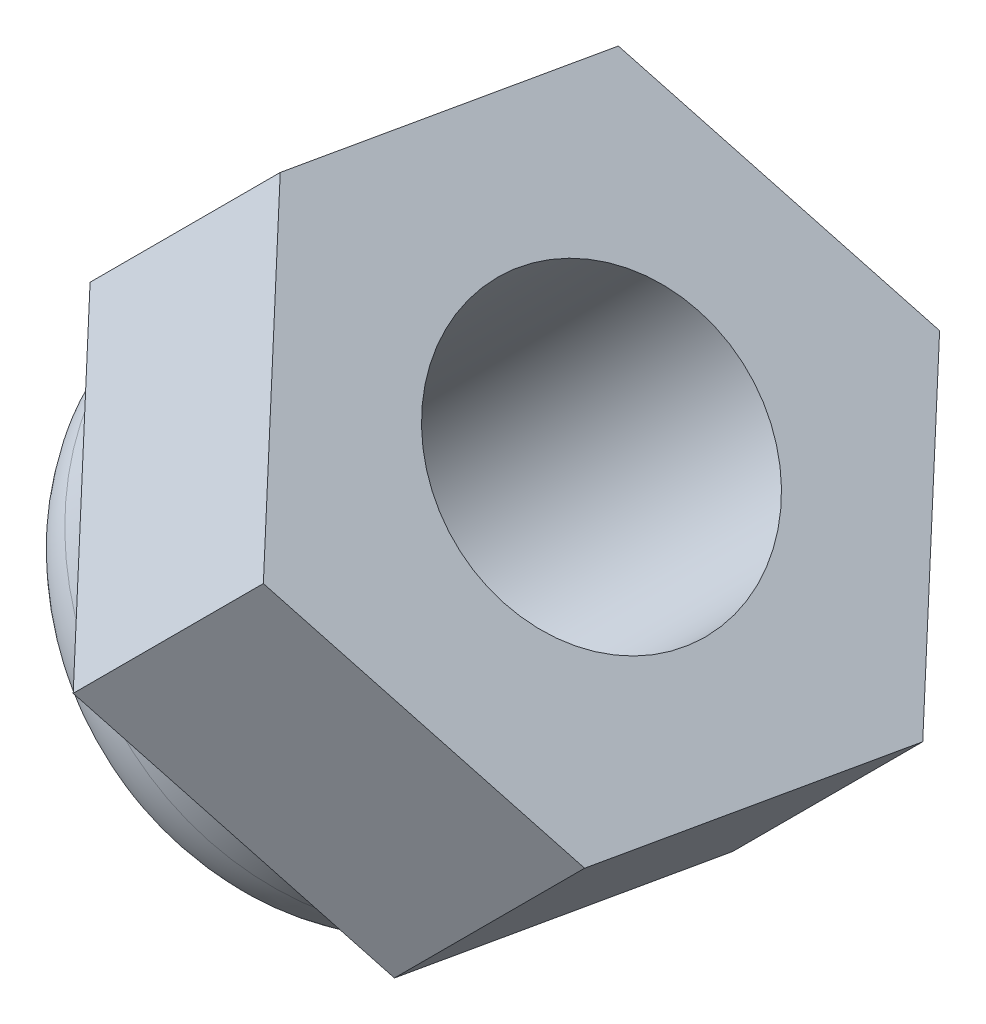
ISO-10303-21;
HEADER;
FILE_DESCRIPTION(('STEP AP214'),'2;1');
FILE_NAME('part.step','',(''),(''),'','','');
FILE_SCHEMA(('AUTOMOTIVE_DESIGN { 1 0 10303 214 1 1 1 1 }'));
ENDSEC;
DATA;
#1=APPLICATION_CONTEXT('core data for automotive mechanical design processes');
#2=APPLICATION_PROTOCOL_DEFINITION('international standard','automotive_design',2000,#1);
#3=PRODUCT_CONTEXT('',#1,'mechanical');
#4=PRODUCT('Part','Part','',(#3));
#5=PRODUCT_RELATED_PRODUCT_CATEGORY('part','',(#4));
#6=PRODUCT_DEFINITION_FORMATION('','',#4);
#7=PRODUCT_DEFINITION_CONTEXT('part definition',#1,'design');
#8=PRODUCT_DEFINITION('design','',#6,#7);
#9=PRODUCT_DEFINITION_SHAPE('','',#8);
#10=(LENGTH_UNIT() NAMED_UNIT(*) SI_UNIT(.MILLI.,.METRE.));
#11=(NAMED_UNIT(*) PLANE_ANGLE_UNIT() SI_UNIT($,.RADIAN.));
#12=(NAMED_UNIT(*) SI_UNIT($,.STERADIAN.) SOLID_ANGLE_UNIT());
#13=UNCERTAINTY_MEASURE_WITH_UNIT(LENGTH_MEASURE(1.E-05),#10,'distance_accuracy_value','');
#14=(GEOMETRIC_REPRESENTATION_CONTEXT(3) GLOBAL_UNCERTAINTY_ASSIGNED_CONTEXT((#13)) GLOBAL_UNIT_ASSIGNED_CONTEXT((#10,
#11,#12)) REPRESENTATION_CONTEXT('',''));
#15=CARTESIAN_POINT('',(0.,0.,0.));
#16=DIRECTION('',(0.,0.,1.));
#17=DIRECTION('',(1.,0.,0.));
#18=AXIS2_PLACEMENT_3D('',#15,#16,#17);
#19=CARTESIAN_POINT('',(-21.8435975632122,-44.7743989689823,53.4673160693475));
#20=DIRECTION('',(0.707105990185904,0.707106781185917,0.00105765972999167));
#21=DIRECTION('',(-0.707107176686664,0.707106385686209,0.));
#22=AXIS2_PLACEMENT_3D('',#19,#20,#21);
#23=CYLINDRICAL_SURFACE('',#22,1.49999999999726);
#24=CARTESIAN_POINT('',(-18.8383971049191,-41.769195148939,53.4718111232));
#25=DIRECTION('',(0.707105990185904,0.707106781185917,0.00105765972999167));
#26=DIRECTION('',(-0.707107176686664,0.707106385686209,0.));
#27=AXIS2_PLACEMENT_3D('',#24,#25,#26);
#28=CIRCLE('',#27,1.49999999999726);
#29=CARTESIAN_POINT('',(-19.8990578699471,-40.7085355704117,53.4718111232));
#30=VERTEX_POINT('',#29);
#31=EDGE_CURVE('E105',#30,#30,#28,.T.);
#32=ORIENTED_EDGE('',*,*,#31,.T.);
#33=EDGE_LOOP('',(#32));
#34=FACE_BOUND('',#33,.T.);
#35=CARTESIAN_POINT('',(-21.8435975632122,-44.7743989689823,53.4673160693475));
#36=DIRECTION('',(0.707105990185904,0.707106781185917,0.00105765972999167));
#37=DIRECTION('',(-0.707107176686664,0.707106385686209,0.));
#38=AXIS2_PLACEMENT_3D('',#35,#36,#37);
#39=CIRCLE('',#38,1.49999999999726);
#40=CARTESIAN_POINT('',(-22.9042583282403,-43.7137393904549,53.4673160693475));
#41=VERTEX_POINT('',#40);
#42=EDGE_CURVE('E109',#41,#41,#39,.T.);
#43=ORIENTED_EDGE('',*,*,#42,.F.);
#44=EDGE_LOOP('',(#43));
#45=FACE_BOUND('',#44,.T.);
#46=ADVANCED_FACE('F17',(#34,#45),#23,.F.);
#47=CARTESIAN_POINT('',(-23.39548276266,-43.22113606169,52.54507796637));
#48=DIRECTION('',(-0.707105990185626,-0.707106781186197,-0.00105765972869598));
#49=DIRECTION('',(0.654896304312514,-0.654330019279192,-0.378104557586792));
#50=AXIS2_PLACEMENT_3D('',#47,#48,#49);
#51=PLANE('',#50);
#52=ORIENTED_EDGE('',*,*,#42,.T.);
#53=EDGE_LOOP('',(#52));
#54=FACE_BOUND('',#53,.T.);
#55=CARTESIAN_POINT('',(-21.8435975632077,-44.7743989689877,53.46731606935));
#56=DIRECTION('',(0.707105990185918,0.707106781185903,0.00105765972999243));
#57=DIRECTION('',(-0.65489630431275,0.654330019279279,0.378104557586232));
#58=AXIS2_PLACEMENT_3D('',#55,#56,#57);
#59=CIRCLE('',#58,1.6000000000029);
#60=CARTESIAN_POINT('',(-20.7957634763075,-45.8213269998343,52.8623487772091));
#61=VERTEX_POINT('',#60);
#62=CARTESIAN_POINT('',(-22.8914316501098,-43.7274709381389,54.0722833614869));
#63=VERTEX_POINT('',#62);
#64=EDGE_CURVE('E112',#61,#63,#59,.F.);
#65=ORIENTED_EDGE('',*,*,#64,.T.);
#66=CARTESIAN_POINT('',(-21.8435975632077,-44.7743989689877,53.46731606935));
#67=DIRECTION('',(0.707105990185918,0.707106781185903,0.00105765972999243));
#68=DIRECTION('',(0.654896304312806,-0.654330019279332,-0.378104557586043));
#69=AXIS2_PLACEMENT_3D('',#66,#67,#68);
#70=CIRCLE('',#69,1.60000000000289);
#71=EDGE_CURVE('E108',#63,#61,#70,.F.);
#72=ORIENTED_EDGE('',*,*,#71,.T.);
#73=EDGE_LOOP('',(#65,#72));
#74=FACE_BOUND('',#73,.T.);
#75=ADVANCED_FACE('F189',(#54,#74),#51,.T.);
#76=CARTESIAN_POINT('',(-21.78977943227,-38.81574595516,52.08778394352));
#77=DIRECTION('',(-0.707105990186317,-0.707106781185504,-0.00105765972988303));
#78=DIRECTION('',(0.65489630431228,-0.654330019279604,-0.378104557586483));
#79=AXIS2_PLACEMENT_3D('',#76,#77,#78);
#80=PLANE('',#79);
#81=ORIENTED_EDGE('',*,*,#31,.F.);
#82=EDGE_LOOP('',(#81));
#83=FACE_BOUND('',#82,.T.);
#84=DIRECTION('',(-0.558389620781067,0.559305418448393,-0.61268138563061));
#85=VECTOR('',#84,1.);
#86=CARTESIAN_POINT('',(-20.0314095775002,-40.5794348969403,55.6452166957999));
#87=LINE('',#86,#85);
#88=CARTESIAN_POINT('',(-19.1448469833551,-41.4674515151694,56.6179790438332));
#89=VERTEX_POINT('',#88);
#90=CARTESIAN_POINT('',(-20.9179721715652,-39.691418278793,54.6724543478583));
#91=VERTEX_POINT('',#90);
#92=EDGE_CURVE('E147',#89,#91,#87,.T.);
#93=ORIENTED_EDGE('',*,*,#92,.F.);
#94=DIRECTION('',(-0.654896304313992,0.654330019277631,0.378104557586932));
#95=VECTOR('',#94,1.);
#96=CARTESIAN_POINT('',(-18.1050594499902,-42.5063399502852,56.0176574315448));
#97=LINE('',#96,#95);
#98=CARTESIAN_POINT('',(-17.0652719166297,-43.5452283854007,55.417335819255));
#99=VERTEX_POINT('',#98);
#100=EDGE_CURVE('E151',#99,#89,#97,.T.);
#101=ORIENTED_EDGE('',*,*,#100,.F.);
#102=DIRECTION('',(-0.0965066835306352,0.0950246008270699,0.990785943214564));
#103=VECTOR('',#102,1.);
#104=CARTESIAN_POINT('',(-16.9120469774152,-43.6961002022853,53.844251858935));
#105=LINE('',#104,#103);
#106=CARTESIAN_POINT('',(-16.7588220382775,-43.8469720190935,52.2711678985342));
#107=VERTEX_POINT('',#106);
#108=EDGE_CURVE('E85',#107,#99,#105,.T.);
#109=ORIENTED_EDGE('',*,*,#108,.F.);
#110=DIRECTION('',(0.558389620781152,-0.55930541845145,0.612681385627742));
#111=VECTOR('',#110,1.);
#112=CARTESIAN_POINT('',(-17.6453846323402,-42.9589554009452,51.2984055505948));
#113=LINE('',#112,#111);
#114=CARTESIAN_POINT('',(-18.5319472264852,-42.0709387827129,50.3256432025663));
#115=VERTEX_POINT('',#114);
#116=EDGE_CURVE('E81',#115,#107,#113,.T.);
#117=ORIENTED_EDGE('',*,*,#116,.F.);
#118=DIRECTION('',(0.65489630431473,-0.654330019278362,-0.37810455758439));
#119=VECTOR('',#118,1.);
#120=CARTESIAN_POINT('',(-19.5717347598502,-41.0320503475954,50.9259648148499));
#121=LINE('',#120,#119);
#122=CARTESIAN_POINT('',(-20.6115222932108,-39.9931619124808,51.5262864271382));
#123=VERTEX_POINT('',#122);
#124=EDGE_CURVE('E156',#123,#115,#121,.T.);
#125=ORIENTED_EDGE('',*,*,#124,.F.);
#126=DIRECTION('',(0.0965066835336381,-0.095024600827036,-0.990785943214275));
#127=VECTOR('',#126,1.);
#128=CARTESIAN_POINT('',(-20.7647472324302,-39.8422900955953,53.0993703874548));
#129=LINE('',#128,#127);
#130=EDGE_CURVE('E137',#91,#123,#129,.T.);
#131=ORIENTED_EDGE('',*,*,#130,.F.);
#132=EDGE_LOOP('',(#93,#101,#109,#117,#125,#131));
#133=FACE_BOUND('',#132,.T.);
#134=ADVANCED_FACE('F166',(#83,#133),#80,.F.);
#135=CARTESIAN_POINT('',(-21.1364915730218,-44.0672921878018,53.46837372908));
#136=DIRECTION('',(-0.707105990185918,-0.707106781185903,-0.00105765972999243));
#137=DIRECTION('',(0.654896304312564,-0.654330019279091,-0.37810455758688));
#138=AXIS2_PLACEMENT_3D('',#135,#136,#137);
#139=TOROIDAL_SURFACE('',#138,1.60000000000256,1.);
#140=ORIENTED_EDGE('',*,*,#64,.F.);
#141=ORIENTED_EDGE('',*,*,#71,.F.);
#142=EDGE_LOOP('',(#140,#141));
#143=FACE_BOUND('',#142,.T.);
#144=CARTESIAN_POINT('',(-21.1364915730096,-44.0672921877846,53.468373729075));
#145=DIRECTION('',(-0.707105990190919,-0.707106781180901,-0.00105765973000686));
#146=DIRECTION('',(0.654896304308537,-0.654330019284319,-0.378104557584808));
#147=AXIS2_PLACEMENT_3D('',#144,#145,#146);
#148=CIRCLE('',#147,2.60000000000498);
#149=CARTESIAN_POINT('',(-19.4337611818041,-45.7685502379271,52.4853018793526));
#150=VERTEX_POINT('',#149);
#151=EDGE_CURVE('E101',#150,#150,#148,.T.);
#152=ORIENTED_EDGE('',*,*,#151,.T.);
#153=EDGE_LOOP('',(#152));
#154=FACE_BOUND('',#153,.T.);
#155=ADVANCED_FACE('F161',(#143,#154),#139,.T.);
#156=CARTESIAN_POINT('',(-20.61422296509,-39.91271550211,51.55035746291));
#157=DIRECTION('',(-0.266668238156112,0.268052655030431,-0.925762293944753));
#158=DIRECTION('',(0.654896304314744,-0.654330019278378,-0.378104557584339));
#159=AXIS2_PLACEMENT_3D('',#156,#157,#158);
#160=PLANE('',#159);
#161=ORIENTED_EDGE('',*,*,#124,.T.);
#162=DIRECTION('',(0.707105990185911,0.707106781185908,0.00105765973077403));
#163=VECTOR('',#162,1.);
#164=CARTESIAN_POINT('',(-19.5042179629892,-43.0432106068442,50.3241889204362));
#165=LINE('',#164,#163);
#166=CARTESIAN_POINT('',(-20.476488699497,-44.015482430978,50.3227346383065));
#167=VERTEX_POINT('',#166);
#168=EDGE_CURVE('E67',#167,#115,#165,.T.);
#169=ORIENTED_EDGE('',*,*,#168,.F.);
#170=DIRECTION('',(0.654896304312922,-0.65433001927875,-0.37810455758685));
#171=VECTOR('',#170,1.);
#172=CARTESIAN_POINT('',(-21.5162762328579,-42.9765939958637,50.9230562505938));
#173=LINE('',#172,#171);
#174=CARTESIAN_POINT('',(-22.556063766219,-41.937705560749,51.5233778628794));
#175=VERTEX_POINT('',#174);
#176=EDGE_CURVE('E99',#175,#167,#173,.T.);
#177=ORIENTED_EDGE('',*,*,#176,.F.);
#178=DIRECTION('',(-0.707105990184196,-0.707106781187624,-0.00105765973077146));
#179=VECTOR('',#178,1.);
#180=CARTESIAN_POINT('',(-21.5837930297139,-40.9654337366145,51.5248321450078));
#181=LINE('',#180,#179);
#182=EDGE_CURVE('E145',#123,#175,#181,.T.);
#183=ORIENTED_EDGE('',*,*,#182,.F.);
#184=EDGE_LOOP('',(#161,#169,#177,#183));
#185=FACE_BOUND('',#184,.T.);
#186=ADVANCED_FACE('F165',(#185),#160,.T.);
#187=CARTESIAN_POINT('',(-18.52851890079,-41.99652724502,50.28679087993));
#188=DIRECTION('',(0.433822717302052,-0.432640091636797,-0.79032929912864));
#189=DIRECTION('',(0.558389620781152,-0.559305418451452,0.61268138562774));
#190=AXIS2_PLACEMENT_3D('',#187,#188,#189);
#191=PLANE('',#190);
#192=ORIENTED_EDGE('',*,*,#116,.T.);
#193=DIRECTION('',(0.707105990184196,0.707106781187628,0.00105765972726562));
#194=VECTOR('',#193,1.);
#195=CARTESIAN_POINT('',(-17.7310927747037,-44.8192438433045,52.2697136164927));
#196=LINE('',#195,#194);
#197=CARTESIAN_POINT('',(-18.7033635112061,-45.7915156674358,52.2682593343666));
#198=VERTEX_POINT('',#197);
#199=EDGE_CURVE('E73',#198,#107,#196,.T.);
#200=ORIENTED_EDGE('',*,*,#199,.F.);
#201=DIRECTION('',(0.5583896207818,-0.559305418450165,0.612681385628325));
#202=VECTOR('',#201,1.);
#203=CARTESIAN_POINT('',(-20.4764886994966,-44.0154824309785,50.3227346383069));
#204=LINE('',#203,#202);
#205=EDGE_CURVE('E77',#167,#198,#204,.T.);
#206=ORIENTED_EDGE('',*,*,#205,.F.);
#207=ORIENTED_EDGE('',*,*,#168,.T.);
#208=EDGE_LOOP('',(#192,#200,#206,#207));
#209=FACE_BOUND('',#208,.T.);
#210=ADVANCED_FACE('F75',(#209),#191,.T.);
#211=CARTESIAN_POINT('',(-16.71380221117,-43.81411601888,52.20830271149));
#212=DIRECTION('',(0.700490955459041,-0.700692746669871,0.135432994814083));
#213=DIRECTION('',(-0.0965066835306358,0.0950246008270116,0.99078594321457));
#214=AXIS2_PLACEMENT_3D('',#211,#212,#213);
#215=PLANE('',#214);
#216=ORIENTED_EDGE('',*,*,#108,.T.);
#217=DIRECTION('',(0.70710599018591,0.70710678118591,0.0010576597307716));
#218=VECTOR('',#217,1.);
#219=CARTESIAN_POINT('',(-18.0375426531296,-44.5175002095304,55.4158815371265));
#220=LINE('',#219,#218);
#221=CARTESIAN_POINT('',(-19.0098133896394,-45.4897720336626,55.4144272549982));
#222=VERTEX_POINT('',#221);
#223=EDGE_CURVE('E91',#222,#99,#220,.T.);
#224=ORIENTED_EDGE('',*,*,#223,.F.);
#225=DIRECTION('',(-0.0965066835310928,0.0950246008285585,0.990785943214377));
#226=VECTOR('',#225,1.);
#227=CARTESIAN_POINT('',(-18.7033635112067,-45.7915156674353,52.2682593343657));
#228=LINE('',#227,#226);
#229=EDGE_CURVE('E88',#198,#222,#228,.T.);
#230=ORIENTED_EDGE('',*,*,#229,.F.);
#231=ORIENTED_EDGE('',*,*,#199,.T.);
#232=EDGE_LOOP('',(#216,#224,#230,#231));
#233=FACE_BOUND('',#232,.T.);
#234=ADVANCED_FACE('F89',(#233),#215,.T.);
#235=CARTESIAN_POINT('',(-16.98478958583,-43.54789304984,55.39338112605));
#236=DIRECTION('',(0.266668238154993,-0.268052655035217,0.92576229394369));
#237=DIRECTION('',(-0.654896304313992,0.654330019277631,0.378104557586932));
#238=AXIS2_PLACEMENT_3D('',#235,#236,#237);
#239=PLANE('',#238);
#240=ORIENTED_EDGE('',*,*,#100,.T.);
#241=DIRECTION('',(0.707105990184198,0.707106781187622,0.00105765973069867));
#242=VECTOR('',#241,1.);
#243=CARTESIAN_POINT('',(-20.1171177198608,-42.4397233393009,56.6165247617038));
#244=LINE('',#243,#242);
#245=CARTESIAN_POINT('',(-21.089388456363,-43.411995163432,56.6150704795736));
#246=VERTEX_POINT('',#245);
#247=EDGE_CURVE('E150',#246,#89,#244,.T.);
#248=ORIENTED_EDGE('',*,*,#247,.F.);
#249=DIRECTION('',(-0.654896304312922,0.654330019278749,0.378104557586851));
#250=VECTOR('',#249,1.);
#251=CARTESIAN_POINT('',(-20.0496009230021,-44.4508835985463,56.0147488672862));
#252=LINE('',#251,#250);
#253=EDGE_CURVE('E95',#222,#246,#252,.T.);
#254=ORIENTED_EDGE('',*,*,#253,.F.);
#255=ORIENTED_EDGE('',*,*,#223,.T.);
#256=EDGE_LOOP('',(#240,#248,#254,#255));
#257=FACE_BOUND('',#256,.T.);
#258=ADVANCED_FACE('F257',(#257),#239,.T.);
#259=CARTESIAN_POINT('',(-19.07049365013,-41.46408130693,56.65694770904));
#260=DIRECTION('',(-0.433822717305185,0.4326400916378,0.790329299126371));
#261=DIRECTION('',(-0.558389620781064,0.559305418448334,-0.612681385630666));
#262=AXIS2_PLACEMENT_3D('',#259,#260,#261);
#263=PLANE('',#262);
#264=ORIENTED_EDGE('',*,*,#92,.T.);
#265=DIRECTION('',(0.707105990185877,0.707106781185943,0.0010576597307667));
#266=VECTOR('',#265,1.);
#267=CARTESIAN_POINT('',(-21.8902429081562,-40.6636901028405,54.6710000656423));
#268=LINE('',#267,#266);
#269=CARTESIAN_POINT('',(-22.8625136446559,-41.6359619269722,54.6695457835127));
#270=VERTEX_POINT('',#269);
#271=EDGE_CURVE('E146',#270,#91,#268,.T.);
#272=ORIENTED_EDGE('',*,*,#271,.F.);
#273=DIRECTION('',(-0.558389620781799,0.559305418450164,-0.612681385628326));
#274=VECTOR('',#273,1.);
#275=CARTESIAN_POINT('',(-21.0893884563634,-43.4119951634315,56.6150704795731));
#276=LINE('',#275,#274);
#277=EDGE_CURVE('E229',#246,#270,#276,.T.);
#278=ORIENTED_EDGE('',*,*,#277,.F.);
#279=ORIENTED_EDGE('',*,*,#247,.T.);
#280=EDGE_LOOP('',(#264,#272,#278,#279));
#281=FACE_BOUND('',#280,.T.);
#282=ADVANCED_FACE('F240',(#281),#263,.T.);
#283=CARTESIAN_POINT('',(-20.88521033976,-39.64649253307,54.73543587747));
#284=DIRECTION('',(-0.700490955456767,0.700692746671739,-0.13543299481618));
#285=DIRECTION('',(0.0965066835336389,-0.0950246008269779,-0.990785943214281));
#286=AXIS2_PLACEMENT_3D('',#283,#284,#285);
#287=PLANE('',#286);
#288=ORIENTED_EDGE('',*,*,#130,.T.);
#289=ORIENTED_EDGE('',*,*,#182,.T.);
#290=DIRECTION('',(0.0965066835310932,-0.0950246008285611,-0.990785943214377));
#291=VECTOR('',#290,1.);
#292=CARTESIAN_POINT('',(-22.8625136446533,-41.6359619269748,54.6695457835143));
#293=LINE('',#292,#291);
#294=EDGE_CURVE('E236',#270,#175,#293,.T.);
#295=ORIENTED_EDGE('',*,*,#294,.F.);
#296=ORIENTED_EDGE('',*,*,#271,.T.);
#297=EDGE_LOOP('',(#288,#289,#295,#296));
#298=FACE_BOUND('',#297,.T.);
#299=ADVANCED_FACE('F246',(#298),#287,.T.);
#300=CARTESIAN_POINT('',(-20.8536491769364,-43.7844494753154,53.468796792967));
#301=DIRECTION('',(-0.707105990190918,-0.707106781180902,-0.00105765973000766));
#302=DIRECTION('',(0.70710717668165,-0.707106385691224,0.));
#303=AXIS2_PLACEMENT_3D('',#300,#301,#302);
#304=CYLINDRICAL_SURFACE('',#303,2.60000000000312);
#305=ORIENTED_EDGE('',*,*,#151,.F.);
#306=EDGE_LOOP('',(#305));
#307=FACE_BOUND('',#306,.T.);
#308=CARTESIAN_POINT('',(-20.8536491769623,-43.7844494753323,53.46879679297));
#309=DIRECTION('',(-0.7071059901809,-0.707106781190921,-0.00105765972998603));
#310=DIRECTION('',(0.654896304317033,-0.654330019274271,-0.37810455758748));
#311=AXIS2_PLACEMENT_3D('',#308,#309,#310);
#312=CIRCLE('',#311,2.60000000001024);
#313=CARTESIAN_POINT('',(-19.1509187857313,-45.4857075254521,52.4857249432387));
#314=VERTEX_POINT('',#313);
#315=EDGE_CURVE('E30',#314,#314,#312,.F.);
#316=ORIENTED_EDGE('',*,*,#315,.F.);
#317=EDGE_LOOP('',(#316));
#318=FACE_BOUND('',#317,.T.);
#319=ADVANCED_FACE('F129',(#307,#318),#304,.T.);
#320=CARTESIAN_POINT('',(-23.73432090528,-40.76028960343,52.08487537926));
#321=DIRECTION('',(-0.707105990185295,-0.707106781186527,-0.0010576597291399));
#322=DIRECTION('',(0.654896304312922,-0.65433001927875,-0.378104557586851));
#323=AXIS2_PLACEMENT_3D('',#320,#321,#322);
#324=PLANE('',#323);
#325=CARTESIAN_POINT('',(-20.7829385779446,-43.7137387972136,53.468902558943));
#326=DIRECTION('',(-0.7071059901809,-0.707106781190921,-0.00105765972998603));
#327=DIRECTION('',(-0.654896304317116,0.654330019274354,0.378104557587194));
#328=AXIS2_PLACEMENT_3D('',#325,#326,#327);
#329=CIRCLE('',#328,2.70000000001055);
#330=CARTESIAN_POINT('',(-22.551158599594,-41.9470477451611,54.4897848644289));
#331=VERTEX_POINT('',#330);
#332=CARTESIAN_POINT('',(-19.0147185562836,-45.4804298492592,52.4480202534546));
#333=VERTEX_POINT('',#332);
#334=EDGE_CURVE('E11',#331,#333,#329,.T.);
#335=ORIENTED_EDGE('',*,*,#334,.F.);
#336=CARTESIAN_POINT('',(-20.7829385779446,-43.7137387972136,53.468902558943));
#337=DIRECTION('',(-0.7071059901809,-0.707106781190921,-0.00105765972998603));
#338=DIRECTION('',(0.654896304317062,-0.654330019274301,-0.378104557587378));
#339=AXIS2_PLACEMENT_3D('',#336,#337,#338);
#340=CIRCLE('',#339,2.70000000001056);
#341=EDGE_CURVE('E37',#331,#333,#340,.F.);
#342=ORIENTED_EDGE('',*,*,#341,.T.);
#343=EDGE_LOOP('',(#335,#342));
#344=FACE_BOUND('',#343,.T.);
#345=ORIENTED_EDGE('',*,*,#277,.T.);
#346=ORIENTED_EDGE('',*,*,#294,.T.);
#347=ORIENTED_EDGE('',*,*,#176,.T.);
#348=ORIENTED_EDGE('',*,*,#205,.T.);
#349=ORIENTED_EDGE('',*,*,#229,.T.);
#350=ORIENTED_EDGE('',*,*,#253,.T.);
#351=EDGE_LOOP('',(#345,#346,#347,#348,#349,#350));
#352=FACE_BOUND('',#351,.T.);
#353=ADVANCED_FACE('F19',(#344,#352),#324,.T.);
#354=CARTESIAN_POINT('',(-20.8536491769627,-43.7844494753327,53.46879679297));
#355=DIRECTION('',(-0.7071059901809,-0.707106781190921,-0.00105765972998603));
#356=DIRECTION('',(0.654896304317043,-0.654330019274281,-0.378104557587445));
#357=AXIS2_PLACEMENT_3D('',#354,#355,#356);
#358=TOROIDAL_SURFACE('',#357,2.70000000001025,0.1);
#359=ORIENTED_EDGE('',*,*,#315,.T.);
#360=EDGE_LOOP('',(#359));
#361=FACE_BOUND('',#360,.T.);
#362=ORIENTED_EDGE('',*,*,#334,.T.);
#363=ORIENTED_EDGE('',*,*,#341,.F.);
#364=EDGE_LOOP('',(#362,#363));
#365=FACE_BOUND('',#364,.T.);
#366=ADVANCED_FACE('F118',(#361,#365),#358,.F.);
#367=CLOSED_SHELL('',(#46,#75,#134,#155,#186,#210,#234,#258,#282,#299,#319,#353,#366));
#368=MANIFOLD_SOLID_BREP('B1',#367);
#369=ADVANCED_BREP_SHAPE_REPRESENTATION('',(#18,#368),#14);
#370=SHAPE_DEFINITION_REPRESENTATION(#9,#369);
ENDSEC;
END-ISO-10303-21;
